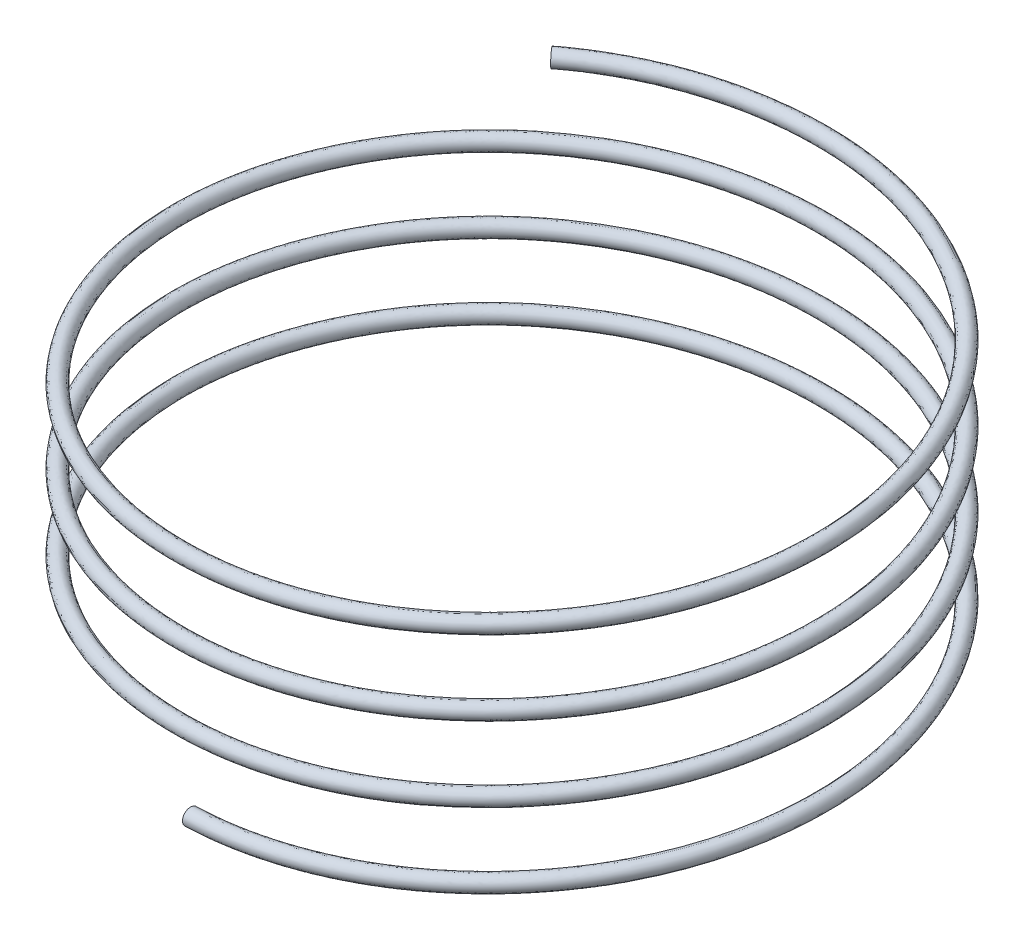
ISO-10303-21;
HEADER;
FILE_DESCRIPTION(('STEP AP214'),'2;1');
FILE_NAME('part.step','',(''),(''),'','','');
FILE_SCHEMA(('AUTOMOTIVE_DESIGN { 1 0 10303 214 1 1 1 1 }'));
ENDSEC;
DATA;
#1=APPLICATION_CONTEXT('core data for automotive mechanical design processes');
#2=APPLICATION_PROTOCOL_DEFINITION('international standard','automotive_design',2000,#1);
#3=PRODUCT_CONTEXT('',#1,'mechanical');
#4=PRODUCT('Part','Part','',(#3));
#5=PRODUCT_RELATED_PRODUCT_CATEGORY('part','',(#4));
#6=PRODUCT_DEFINITION_FORMATION('','',#4);
#7=PRODUCT_DEFINITION_CONTEXT('part definition',#1,'design');
#8=PRODUCT_DEFINITION('design','',#6,#7);
#9=PRODUCT_DEFINITION_SHAPE('','',#8);
#10=(LENGTH_UNIT() NAMED_UNIT(*) SI_UNIT(.MILLI.,.METRE.));
#11=(NAMED_UNIT(*) PLANE_ANGLE_UNIT() SI_UNIT($,.RADIAN.));
#12=(NAMED_UNIT(*) SI_UNIT($,.STERADIAN.) SOLID_ANGLE_UNIT());
#13=UNCERTAINTY_MEASURE_WITH_UNIT(LENGTH_MEASURE(1.E-05),#10,'distance_accuracy_value','');
#14=(GEOMETRIC_REPRESENTATION_CONTEXT(3) GLOBAL_UNCERTAINTY_ASSIGNED_CONTEXT((#13)) GLOBAL_UNIT_ASSIGNED_CONTEXT((#10,
#11,#12)) REPRESENTATION_CONTEXT('',''));
#15=CARTESIAN_POINT('',(0.,0.,0.));
#16=DIRECTION('',(0.,0.,1.));
#17=DIRECTION('',(1.,0.,0.));
#18=AXIS2_PLACEMENT_3D('',#15,#16,#17);
#19=CARTESIAN_POINT('',(0.,0.,10.));
#20=DIRECTION('',(1.,0.,0.));
#21=DIRECTION('',(0.,0.,-1.));
#22=AXIS2_PLACEMENT_3D('',#19,#20,#21);
#23=PLANE('',#22);
#24=CARTESIAN_POINT('',(0.,0.,10.));
#25=DIRECTION('',(1.,0.,0.));
#26=DIRECTION('',(0.,0.,-1.));
#27=AXIS2_PLACEMENT_3D('',#24,#25,#26);
#28=CIRCLE('',#27,0.25);
#29=CARTESIAN_POINT('',(0.,0.,9.75));
#30=VERTEX_POINT('',#29);
#31=EDGE_CURVE('E41',#30,#30,#28,.T.);
#32=ORIENTED_EDGE('',*,*,#31,.F.);
#33=EDGE_LOOP('',(#32));
#34=FACE_BOUND('',#33,.T.);
#35=ADVANCED_FACE('F33',(#34),#23,.F.);
#36=CARTESIAN_POINT('',(-6.42787609686579,8.4,-7.66044443118945));
#37=DIRECTION('',(-0.766044443118945,0.,0.642787609686579));
#38=DIRECTION('',(0.642787609686579,0.,0.766044443118945));
#39=AXIS2_PLACEMENT_3D('',#36,#37,#38);
#40=PLANE('',#39);
#41=CARTESIAN_POINT('',(-6.42787609686579,8.4,-7.66044443118945));
#42=DIRECTION('',(-0.766044443118945,0.,0.642787609686579));
#43=DIRECTION('',(0.642787609686579,0.,0.766044443118945));
#44=AXIS2_PLACEMENT_3D('',#41,#42,#43);
#45=CIRCLE('',#44,0.25);
#46=CARTESIAN_POINT('',(-6.2671433535875,8.40270245496322,-7.46897292753842));
#47=VERTEX_POINT('',#46);
#48=EDGE_CURVE('E11',#47,#47,#45,.T.);
#49=ORIENTED_EDGE('',*,*,#48,.T.);
#50=EDGE_LOOP('',(#49));
#51=FACE_BOUND('',#50,.T.);
#52=ADVANCED_FACE('F49',(#51),#40,.T.);
#53=CARTESIAN_POINT('',(0.,0.,9.75));
#54=CARTESIAN_POINT('',(5.62916512459885,0.193846153846153,9.75));
#55=CARTESIAN_POINT('',(8.44374768689828,0.387692307692307,4.875));
#56=CARTESIAN_POINT('',(11.2583302491977,0.58153846153846,0.));
#57=CARTESIAN_POINT('',(8.44374768689828,0.775384615384614,-4.875));
#58=CARTESIAN_POINT('',(5.62916512459886,0.969230769230767,-9.75));
#59=CARTESIAN_POINT('',(0.,1.16307692307692,-9.75));
#60=CARTESIAN_POINT('',(-5.62916512459885,1.35692307692307,-9.75));
#61=CARTESIAN_POINT('',(-8.44374768689828,1.55076923076923,-4.87500000000001));
#62=CARTESIAN_POINT('',(-11.2583302491977,1.74461538461538,0.));
#63=CARTESIAN_POINT('',(-8.44374768689828,1.93846153846153,4.87499999999999));
#64=CARTESIAN_POINT('',(-5.62916512459886,2.13230769230769,9.75));
#65=CARTESIAN_POINT('',(0.,2.32615384615384,9.75));
#66=CARTESIAN_POINT('',(5.62916512459885,2.51999999999999,9.75));
#67=CARTESIAN_POINT('',(8.44374768689828,2.71384615384615,4.875));
#68=CARTESIAN_POINT('',(11.2583302491977,2.9076923076923,0.));
#69=CARTESIAN_POINT('',(8.44374768689828,3.10153846153845,-4.875));
#70=CARTESIAN_POINT('',(5.62916512459886,3.29538461538461,-9.75));
#71=CARTESIAN_POINT('',(0.,3.48923076923076,-9.75));
#72=CARTESIAN_POINT('',(-5.62916512459885,3.68307692307691,-9.75));
#73=CARTESIAN_POINT('',(-8.44374768689828,3.87692307692307,-4.87500000000001));
#74=CARTESIAN_POINT('',(-11.2583302491977,4.07076923076922,0.));
#75=CARTESIAN_POINT('',(-8.44374768689828,4.26461538461538,4.87499999999999));
#76=CARTESIAN_POINT('',(-5.62916512459886,4.45846153846153,9.75));
#77=CARTESIAN_POINT('',(0.,4.65230769230768,9.75));
#78=CARTESIAN_POINT('',(5.62916512459885,4.84615384615384,9.75));
#79=CARTESIAN_POINT('',(8.44374768689828,5.03999999999999,4.875));
#80=CARTESIAN_POINT('',(11.2583302491977,5.23384615384614,0.));
#81=CARTESIAN_POINT('',(8.44374768689828,5.4276923076923,-4.875));
#82=CARTESIAN_POINT('',(5.62916512459886,5.62153846153845,-9.75));
#83=CARTESIAN_POINT('',(0.,5.8153846153846,-9.75));
#84=CARTESIAN_POINT('',(-5.62916512459885,6.00923076923076,-9.75));
#85=CARTESIAN_POINT('',(-8.44374768689828,6.20307692307691,-4.87500000000001));
#86=CARTESIAN_POINT('',(-11.2583302491977,6.39692307692306,0.));
#87=CARTESIAN_POINT('',(-8.44374768689828,6.59076923076922,4.87499999999999));
#88=CARTESIAN_POINT('',(-5.62916512459886,6.78461538461537,9.75));
#89=CARTESIAN_POINT('',(0.,6.97846153846152,9.75));
#90=CARTESIAN_POINT('',(5.62916512459885,7.17230769230768,9.75));
#91=CARTESIAN_POINT('',(8.44374768689828,7.36615384615383,4.875));
#92=CARTESIAN_POINT('',(11.2583302491977,7.55999999999998,0.));
#93=CARTESIAN_POINT('',(8.44374768689828,7.75384615384614,-4.875));
#94=CARTESIAN_POINT('',(5.62916512459886,7.94769230769229,-9.75));
#95=CARTESIAN_POINT('',(0.,8.14153846153844,-9.75));
#96=CARTESIAN_POINT('',(-5.62916512459885,8.3353846153846,-9.75));
#97=CARTESIAN_POINT('',(-8.44374768689828,8.52923076923075,-4.87500000000001));
#98=CARTESIAN_POINT('',(-11.2583302491977,8.7230769230769,0.));
#99=CARTESIAN_POINT('',(-8.44374768689828,8.91692307692306,4.87499999999999));
#100=CARTESIAN_POINT('',(-5.62916512459886,9.11076923076921,9.75));
#101=CARTESIAN_POINT('',(0.,9.30461538461536,9.75));
#102=CARTESIAN_POINT('',(0.,0.499999999999999,9.75));
#103=CARTESIAN_POINT('',(5.62916512459885,0.693846153846152,9.75));
#104=CARTESIAN_POINT('',(8.44374768689828,0.887692307692306,4.875));
#105=CARTESIAN_POINT('',(11.2583302491977,1.08153846153846,0.));
#106=CARTESIAN_POINT('',(8.44374768689828,1.27538461538461,-4.875));
#107=CARTESIAN_POINT('',(5.62916512459886,1.46923076923077,-9.75));
#108=CARTESIAN_POINT('',(0.,1.66307692307692,-9.75));
#109=CARTESIAN_POINT('',(-5.62916512459885,1.85692307692307,-9.75));
#110=CARTESIAN_POINT('',(-8.44374768689828,2.05076923076923,-4.87500000000001));
#111=CARTESIAN_POINT('',(-11.2583302491977,2.24461538461538,0.));
#112=CARTESIAN_POINT('',(-8.44374768689828,2.43846153846153,4.87499999999999));
#113=CARTESIAN_POINT('',(-5.62916512459886,2.63230769230769,9.75));
#114=CARTESIAN_POINT('',(0.,2.82615384615384,9.75));
#115=CARTESIAN_POINT('',(5.62916512459885,3.01999999999999,9.75));
#116=CARTESIAN_POINT('',(8.44374768689828,3.21384615384615,4.875));
#117=CARTESIAN_POINT('',(11.2583302491977,3.4076923076923,0.));
#118=CARTESIAN_POINT('',(8.44374768689828,3.60153846153845,-4.875));
#119=CARTESIAN_POINT('',(5.62916512459886,3.79538461538461,-9.75));
#120=CARTESIAN_POINT('',(0.,3.98923076923076,-9.75));
#121=CARTESIAN_POINT('',(-5.62916512459885,4.18307692307691,-9.75));
#122=CARTESIAN_POINT('',(-8.44374768689828,4.37692307692307,-4.87500000000001));
#123=CARTESIAN_POINT('',(-11.2583302491977,4.57076923076922,0.));
#124=CARTESIAN_POINT('',(-8.44374768689828,4.76461538461537,4.87499999999999));
#125=CARTESIAN_POINT('',(-5.62916512459886,4.95846153846153,9.75));
#126=CARTESIAN_POINT('',(0.,5.15230769230768,9.75));
#127=CARTESIAN_POINT('',(5.62916512459885,5.34615384615383,9.75));
#128=CARTESIAN_POINT('',(8.44374768689828,5.53999999999999,4.875));
#129=CARTESIAN_POINT('',(11.2583302491977,5.73384615384614,0.));
#130=CARTESIAN_POINT('',(8.44374768689828,5.92769230769229,-4.875));
#131=CARTESIAN_POINT('',(5.62916512459886,6.12153846153845,-9.75));
#132=CARTESIAN_POINT('',(0.,6.3153846153846,-9.75));
#133=CARTESIAN_POINT('',(-5.62916512459885,6.50923076923076,-9.75));
#134=CARTESIAN_POINT('',(-8.44374768689828,6.70307692307691,-4.87500000000001));
#135=CARTESIAN_POINT('',(-11.2583302491977,6.89692307692306,0.));
#136=CARTESIAN_POINT('',(-8.44374768689828,7.09076923076922,4.87499999999999));
#137=CARTESIAN_POINT('',(-5.62916512459886,7.28461538461537,9.75));
#138=CARTESIAN_POINT('',(0.,7.47846153846152,9.75));
#139=CARTESIAN_POINT('',(5.62916512459885,7.67230769230768,9.75));
#140=CARTESIAN_POINT('',(8.44374768689828,7.86615384615383,4.875));
#141=CARTESIAN_POINT('',(11.2583302491977,8.05999999999998,0.));
#142=CARTESIAN_POINT('',(8.44374768689828,8.25384615384614,-4.875));
#143=CARTESIAN_POINT('',(5.62916512459886,8.44769230769229,-9.75));
#144=CARTESIAN_POINT('',(0.,8.64153846153844,-9.75));
#145=CARTESIAN_POINT('',(-5.62916512459885,8.8353846153846,-9.75));
#146=CARTESIAN_POINT('',(-8.44374768689828,9.02923076923075,-4.87500000000001));
#147=CARTESIAN_POINT('',(-11.2583302491977,9.2230769230769,0.));
#148=CARTESIAN_POINT('',(-8.44374768689828,9.41692307692306,4.87499999999999));
#149=CARTESIAN_POINT('',(-5.62916512459886,9.61076923076921,9.75));
#150=CARTESIAN_POINT('',(0.,9.80461538461536,9.75));
#151=CARTESIAN_POINT('',(0.,0.499999999999999,10.25));
#152=CARTESIAN_POINT('',(5.91784025919366,0.693846153846152,10.25));
#153=CARTESIAN_POINT('',(8.8767603887905,0.887692307692306,5.125));
#154=CARTESIAN_POINT('',(11.8356805183873,1.08153846153846,0.));
#155=CARTESIAN_POINT('',(8.8767603887905,1.27538461538461,-5.125));
#156=CARTESIAN_POINT('',(5.91784025919367,1.46923076923077,-10.25));
#157=CARTESIAN_POINT('',(0.,1.66307692307692,-10.25));
#158=CARTESIAN_POINT('',(-5.91784025919366,1.85692307692307,-10.25));
#159=CARTESIAN_POINT('',(-8.8767603887905,2.05076923076923,-5.12500000000001));
#160=CARTESIAN_POINT('',(-11.8356805183873,2.24461538461538,0.));
#161=CARTESIAN_POINT('',(-8.8767603887905,2.43846153846153,5.12499999999999));
#162=CARTESIAN_POINT('',(-5.91784025919367,2.63230769230769,10.25));
#163=CARTESIAN_POINT('',(0.,2.82615384615384,10.25));
#164=CARTESIAN_POINT('',(5.91784025919366,3.01999999999999,10.25));
#165=CARTESIAN_POINT('',(8.8767603887905,3.21384615384615,5.125));
#166=CARTESIAN_POINT('',(11.8356805183873,3.4076923076923,0.));
#167=CARTESIAN_POINT('',(8.8767603887905,3.60153846153845,-5.125));
#168=CARTESIAN_POINT('',(5.91784025919367,3.79538461538461,-10.25));
#169=CARTESIAN_POINT('',(0.,3.98923076923076,-10.25));
#170=CARTESIAN_POINT('',(-5.91784025919366,4.18307692307691,-10.25));
#171=CARTESIAN_POINT('',(-8.8767603887905,4.37692307692307,-5.12500000000001));
#172=CARTESIAN_POINT('',(-11.8356805183873,4.57076923076922,0.));
#173=CARTESIAN_POINT('',(-8.8767603887905,4.76461538461537,5.12499999999999));
#174=CARTESIAN_POINT('',(-5.91784025919367,4.95846153846153,10.25));
#175=CARTESIAN_POINT('',(0.,5.15230769230768,10.25));
#176=CARTESIAN_POINT('',(5.91784025919366,5.34615384615383,10.25));
#177=CARTESIAN_POINT('',(8.8767603887905,5.53999999999999,5.125));
#178=CARTESIAN_POINT('',(11.8356805183873,5.73384615384614,0.));
#179=CARTESIAN_POINT('',(8.8767603887905,5.92769230769229,-5.125));
#180=CARTESIAN_POINT('',(5.91784025919367,6.12153846153845,-10.25));
#181=CARTESIAN_POINT('',(0.,6.3153846153846,-10.25));
#182=CARTESIAN_POINT('',(-5.91784025919366,6.50923076923076,-10.25));
#183=CARTESIAN_POINT('',(-8.8767603887905,6.70307692307691,-5.12500000000001));
#184=CARTESIAN_POINT('',(-11.8356805183873,6.89692307692306,0.));
#185=CARTESIAN_POINT('',(-8.8767603887905,7.09076923076922,5.12499999999999));
#186=CARTESIAN_POINT('',(-5.91784025919367,7.28461538461537,10.25));
#187=CARTESIAN_POINT('',(0.,7.47846153846152,10.25));
#188=CARTESIAN_POINT('',(5.91784025919366,7.67230769230768,10.25));
#189=CARTESIAN_POINT('',(8.8767603887905,7.86615384615383,5.125));
#190=CARTESIAN_POINT('',(11.8356805183873,8.05999999999998,0.));
#191=CARTESIAN_POINT('',(8.8767603887905,8.25384615384614,-5.125));
#192=CARTESIAN_POINT('',(5.91784025919367,8.44769230769229,-10.25));
#193=CARTESIAN_POINT('',(0.,8.64153846153844,-10.25));
#194=CARTESIAN_POINT('',(-5.91784025919366,8.8353846153846,-10.25));
#195=CARTESIAN_POINT('',(-8.8767603887905,9.02923076923075,-5.12500000000001));
#196=CARTESIAN_POINT('',(-11.8356805183873,9.2230769230769,0.));
#197=CARTESIAN_POINT('',(-8.8767603887905,9.41692307692306,5.12499999999999));
#198=CARTESIAN_POINT('',(-5.91784025919367,9.61076923076921,10.25));
#199=CARTESIAN_POINT('',(0.,9.80461538461536,10.25));
#200=CARTESIAN_POINT('',(0.,0.,10.25));
#201=CARTESIAN_POINT('',(5.91784025919366,0.193846153846153,10.25));
#202=CARTESIAN_POINT('',(8.8767603887905,0.387692307692307,5.125));
#203=CARTESIAN_POINT('',(11.8356805183873,0.58153846153846,0.));
#204=CARTESIAN_POINT('',(8.8767603887905,0.775384615384614,-5.125));
#205=CARTESIAN_POINT('',(5.91784025919367,0.969230769230767,-10.25));
#206=CARTESIAN_POINT('',(0.,1.16307692307692,-10.25));
#207=CARTESIAN_POINT('',(-5.91784025919366,1.35692307692307,-10.25));
#208=CARTESIAN_POINT('',(-8.8767603887905,1.55076923076923,-5.12500000000001));
#209=CARTESIAN_POINT('',(-11.8356805183873,1.74461538461538,0.));
#210=CARTESIAN_POINT('',(-8.8767603887905,1.93846153846153,5.12499999999999));
#211=CARTESIAN_POINT('',(-5.91784025919367,2.13230769230769,10.25));
#212=CARTESIAN_POINT('',(0.,2.32615384615384,10.25));
#213=CARTESIAN_POINT('',(5.91784025919366,2.51999999999999,10.25));
#214=CARTESIAN_POINT('',(8.8767603887905,2.71384615384615,5.125));
#215=CARTESIAN_POINT('',(11.8356805183873,2.9076923076923,0.));
#216=CARTESIAN_POINT('',(8.8767603887905,3.10153846153845,-5.125));
#217=CARTESIAN_POINT('',(5.91784025919367,3.29538461538461,-10.25));
#218=CARTESIAN_POINT('',(0.,3.48923076923076,-10.25));
#219=CARTESIAN_POINT('',(-5.91784025919366,3.68307692307691,-10.25));
#220=CARTESIAN_POINT('',(-8.8767603887905,3.87692307692307,-5.12500000000001));
#221=CARTESIAN_POINT('',(-11.8356805183873,4.07076923076922,0.));
#222=CARTESIAN_POINT('',(-8.8767603887905,4.26461538461538,5.12499999999999));
#223=CARTESIAN_POINT('',(-5.91784025919367,4.45846153846153,10.25));
#224=CARTESIAN_POINT('',(0.,4.65230769230768,10.25));
#225=CARTESIAN_POINT('',(5.91784025919366,4.84615384615384,10.25));
#226=CARTESIAN_POINT('',(8.8767603887905,5.03999999999999,5.125));
#227=CARTESIAN_POINT('',(11.8356805183873,5.23384615384614,0.));
#228=CARTESIAN_POINT('',(8.8767603887905,5.4276923076923,-5.125));
#229=CARTESIAN_POINT('',(5.91784025919367,5.62153846153845,-10.25));
#230=CARTESIAN_POINT('',(0.,5.8153846153846,-10.25));
#231=CARTESIAN_POINT('',(-5.91784025919366,6.00923076923076,-10.25));
#232=CARTESIAN_POINT('',(-8.8767603887905,6.20307692307691,-5.12500000000001));
#233=CARTESIAN_POINT('',(-11.8356805183873,6.39692307692306,0.));
#234=CARTESIAN_POINT('',(-8.8767603887905,6.59076923076922,5.12499999999999));
#235=CARTESIAN_POINT('',(-5.91784025919367,6.78461538461537,10.25));
#236=CARTESIAN_POINT('',(0.,6.97846153846152,10.25));
#237=CARTESIAN_POINT('',(5.91784025919366,7.17230769230768,10.25));
#238=CARTESIAN_POINT('',(8.8767603887905,7.36615384615383,5.125));
#239=CARTESIAN_POINT('',(11.8356805183873,7.55999999999998,0.));
#240=CARTESIAN_POINT('',(8.8767603887905,7.75384615384614,-5.125));
#241=CARTESIAN_POINT('',(5.91784025919367,7.94769230769229,-10.25));
#242=CARTESIAN_POINT('',(0.,8.14153846153844,-10.25));
#243=CARTESIAN_POINT('',(-5.91784025919366,8.3353846153846,-10.25));
#244=CARTESIAN_POINT('',(-8.8767603887905,8.52923076923075,-5.12500000000001));
#245=CARTESIAN_POINT('',(-11.8356805183873,8.7230769230769,0.));
#246=CARTESIAN_POINT('',(-8.8767603887905,8.91692307692306,5.12499999999999));
#247=CARTESIAN_POINT('',(-5.91784025919367,9.11076923076921,10.25));
#248=CARTESIAN_POINT('',(0.,9.30461538461536,10.25));
#249=CARTESIAN_POINT('',(0.,-0.499999999999999,10.25));
#250=CARTESIAN_POINT('',(5.91784025919366,-0.306153846153846,10.25));
#251=CARTESIAN_POINT('',(8.8767603887905,-0.112307692307692,5.125));
#252=CARTESIAN_POINT('',(11.8356805183873,0.0815384615384614,0.));
#253=CARTESIAN_POINT('',(8.8767603887905,0.275384615384615,-5.125));
#254=CARTESIAN_POINT('',(5.91784025919367,0.469230769230768,-10.25));
#255=CARTESIAN_POINT('',(0.,0.663076923076922,-10.25));
#256=CARTESIAN_POINT('',(-5.91784025919366,0.856923076923075,-10.25));
#257=CARTESIAN_POINT('',(-8.8767603887905,1.05076923076923,-5.12500000000001));
#258=CARTESIAN_POINT('',(-11.8356805183873,1.24461538461538,0.));
#259=CARTESIAN_POINT('',(-8.8767603887905,1.43846153846154,5.12499999999999));
#260=CARTESIAN_POINT('',(-5.91784025919367,1.63230769230769,10.25));
#261=CARTESIAN_POINT('',(0.,1.82615384615384,10.25));
#262=CARTESIAN_POINT('',(5.91784025919366,2.02,10.25));
#263=CARTESIAN_POINT('',(8.8767603887905,2.21384615384615,5.125));
#264=CARTESIAN_POINT('',(11.8356805183873,2.4076923076923,0.));
#265=CARTESIAN_POINT('',(8.8767603887905,2.60153846153846,-5.125));
#266=CARTESIAN_POINT('',(5.91784025919367,2.79538461538461,-10.25));
#267=CARTESIAN_POINT('',(0.,2.98923076923076,-10.25));
#268=CARTESIAN_POINT('',(-5.91784025919366,3.18307692307692,-10.25));
#269=CARTESIAN_POINT('',(-8.8767603887905,3.37692307692307,-5.12500000000001));
#270=CARTESIAN_POINT('',(-11.8356805183873,3.57076923076922,0.));
#271=CARTESIAN_POINT('',(-8.8767603887905,3.76461538461538,5.12499999999999));
#272=CARTESIAN_POINT('',(-5.91784025919367,3.95846153846153,10.25));
#273=CARTESIAN_POINT('',(0.,4.15230769230768,10.25));
#274=CARTESIAN_POINT('',(5.91784025919366,4.34615384615384,10.25));
#275=CARTESIAN_POINT('',(8.8767603887905,4.53999999999999,5.125));
#276=CARTESIAN_POINT('',(11.8356805183873,4.73384615384614,0.));
#277=CARTESIAN_POINT('',(8.8767603887905,4.9276923076923,-5.125));
#278=CARTESIAN_POINT('',(5.91784025919367,5.12153846153845,-10.25));
#279=CARTESIAN_POINT('',(0.,5.3153846153846,-10.25));
#280=CARTESIAN_POINT('',(-5.91784025919366,5.50923076923076,-10.25));
#281=CARTESIAN_POINT('',(-8.8767603887905,5.70307692307691,-5.12500000000001));
#282=CARTESIAN_POINT('',(-11.8356805183873,5.89692307692306,0.));
#283=CARTESIAN_POINT('',(-8.8767603887905,6.09076923076922,5.12499999999999));
#284=CARTESIAN_POINT('',(-5.91784025919367,6.28461538461537,10.25));
#285=CARTESIAN_POINT('',(0.,6.47846153846152,10.25));
#286=CARTESIAN_POINT('',(5.91784025919366,6.67230769230768,10.25));
#287=CARTESIAN_POINT('',(8.8767603887905,6.86615384615383,5.125));
#288=CARTESIAN_POINT('',(11.8356805183873,7.05999999999998,0.));
#289=CARTESIAN_POINT('',(8.8767603887905,7.25384615384614,-5.125));
#290=CARTESIAN_POINT('',(5.91784025919367,7.44769230769229,-10.25));
#291=CARTESIAN_POINT('',(0.,7.64153846153844,-10.25));
#292=CARTESIAN_POINT('',(-5.91784025919366,7.8353846153846,-10.25));
#293=CARTESIAN_POINT('',(-8.8767603887905,8.02923076923075,-5.12500000000001));
#294=CARTESIAN_POINT('',(-11.8356805183873,8.2230769230769,0.));
#295=CARTESIAN_POINT('',(-8.8767603887905,8.41692307692306,5.12499999999999));
#296=CARTESIAN_POINT('',(-5.91784025919367,8.61076923076921,10.25));
#297=CARTESIAN_POINT('',(0.,8.80461538461537,10.25));
#298=CARTESIAN_POINT('',(0.,-0.499999999999999,9.75));
#299=CARTESIAN_POINT('',(5.62916512459885,-0.306153846153846,9.75));
#300=CARTESIAN_POINT('',(8.44374768689828,-0.112307692307692,4.875));
#301=CARTESIAN_POINT('',(11.2583302491977,0.0815384615384614,0.));
#302=CARTESIAN_POINT('',(8.44374768689828,0.275384615384615,-4.875));
#303=CARTESIAN_POINT('',(5.62916512459886,0.469230769230768,-9.75));
#304=CARTESIAN_POINT('',(0.,0.663076923076922,-9.75));
#305=CARTESIAN_POINT('',(-5.62916512459885,0.856923076923075,-9.75));
#306=CARTESIAN_POINT('',(-8.44374768689828,1.05076923076923,-4.87500000000001));
#307=CARTESIAN_POINT('',(-11.2583302491977,1.24461538461538,0.));
#308=CARTESIAN_POINT('',(-8.44374768689828,1.43846153846154,4.87499999999999));
#309=CARTESIAN_POINT('',(-5.62916512459886,1.63230769230769,9.75));
#310=CARTESIAN_POINT('',(0.,1.82615384615384,9.75));
#311=CARTESIAN_POINT('',(5.62916512459885,2.02,9.75));
#312=CARTESIAN_POINT('',(8.44374768689828,2.21384615384615,4.875));
#313=CARTESIAN_POINT('',(11.2583302491977,2.4076923076923,0.));
#314=CARTESIAN_POINT('',(8.44374768689828,2.60153846153846,-4.875));
#315=CARTESIAN_POINT('',(5.62916512459886,2.79538461538461,-9.75));
#316=CARTESIAN_POINT('',(0.,2.98923076923076,-9.75));
#317=CARTESIAN_POINT('',(-5.62916512459885,3.18307692307692,-9.75));
#318=CARTESIAN_POINT('',(-8.44374768689828,3.37692307692307,-4.87500000000001));
#319=CARTESIAN_POINT('',(-11.2583302491977,3.57076923076922,0.));
#320=CARTESIAN_POINT('',(-8.44374768689828,3.76461538461538,4.87499999999999));
#321=CARTESIAN_POINT('',(-5.62916512459886,3.95846153846153,9.75));
#322=CARTESIAN_POINT('',(0.,4.15230769230768,9.75));
#323=CARTESIAN_POINT('',(5.62916512459885,4.34615384615384,9.75));
#324=CARTESIAN_POINT('',(8.44374768689828,4.53999999999999,4.875));
#325=CARTESIAN_POINT('',(11.2583302491977,4.73384615384614,0.));
#326=CARTESIAN_POINT('',(8.44374768689828,4.9276923076923,-4.875));
#327=CARTESIAN_POINT('',(5.62916512459886,5.12153846153845,-9.75));
#328=CARTESIAN_POINT('',(0.,5.3153846153846,-9.75));
#329=CARTESIAN_POINT('',(-5.62916512459885,5.50923076923076,-9.75));
#330=CARTESIAN_POINT('',(-8.44374768689828,5.70307692307691,-4.87500000000001));
#331=CARTESIAN_POINT('',(-11.2583302491977,5.89692307692306,0.));
#332=CARTESIAN_POINT('',(-8.44374768689828,6.09076923076922,4.87499999999999));
#333=CARTESIAN_POINT('',(-5.62916512459886,6.28461538461537,9.75));
#334=CARTESIAN_POINT('',(0.,6.47846153846152,9.75));
#335=CARTESIAN_POINT('',(5.62916512459885,6.67230769230768,9.75));
#336=CARTESIAN_POINT('',(8.44374768689828,6.86615384615383,4.875));
#337=CARTESIAN_POINT('',(11.2583302491977,7.05999999999998,0.));
#338=CARTESIAN_POINT('',(8.44374768689828,7.25384615384614,-4.875));
#339=CARTESIAN_POINT('',(5.62916512459886,7.44769230769229,-9.75));
#340=CARTESIAN_POINT('',(0.,7.64153846153844,-9.75));
#341=CARTESIAN_POINT('',(-5.62916512459885,7.8353846153846,-9.75));
#342=CARTESIAN_POINT('',(-8.44374768689828,8.02923076923075,-4.87500000000001));
#343=CARTESIAN_POINT('',(-11.2583302491977,8.2230769230769,0.));
#344=CARTESIAN_POINT('',(-8.44374768689828,8.41692307692306,4.87499999999999));
#345=CARTESIAN_POINT('',(-5.62916512459886,8.61076923076921,9.75));
#346=CARTESIAN_POINT('',(0.,8.80461538461537,9.75));
#347=CARTESIAN_POINT('',(0.,0.,9.75));
#348=CARTESIAN_POINT('',(5.62916512459885,0.193846153846153,9.75));
#349=CARTESIAN_POINT('',(8.44374768689828,0.387692307692307,4.875));
#350=CARTESIAN_POINT('',(11.2583302491977,0.58153846153846,0.));
#351=CARTESIAN_POINT('',(8.44374768689828,0.775384615384614,-4.875));
#352=CARTESIAN_POINT('',(5.62916512459886,0.969230769230767,-9.75));
#353=CARTESIAN_POINT('',(0.,1.16307692307692,-9.75));
#354=CARTESIAN_POINT('',(-5.62916512459885,1.35692307692307,-9.75));
#355=CARTESIAN_POINT('',(-8.44374768689828,1.55076923076923,-4.87500000000001));
#356=CARTESIAN_POINT('',(-11.2583302491977,1.74461538461538,0.));
#357=CARTESIAN_POINT('',(-8.44374768689828,1.93846153846153,4.87499999999999));
#358=CARTESIAN_POINT('',(-5.62916512459886,2.13230769230769,9.75));
#359=CARTESIAN_POINT('',(0.,2.32615384615384,9.75));
#360=CARTESIAN_POINT('',(5.62916512459885,2.51999999999999,9.75));
#361=CARTESIAN_POINT('',(8.44374768689828,2.71384615384615,4.875));
#362=CARTESIAN_POINT('',(11.2583302491977,2.9076923076923,0.));
#363=CARTESIAN_POINT('',(8.44374768689828,3.10153846153845,-4.875));
#364=CARTESIAN_POINT('',(5.62916512459886,3.29538461538461,-9.75));
#365=CARTESIAN_POINT('',(0.,3.48923076923076,-9.75));
#366=CARTESIAN_POINT('',(-5.62916512459885,3.68307692307691,-9.75));
#367=CARTESIAN_POINT('',(-8.44374768689828,3.87692307692307,-4.87500000000001));
#368=CARTESIAN_POINT('',(-11.2583302491977,4.07076923076922,0.));
#369=CARTESIAN_POINT('',(-8.44374768689828,4.26461538461538,4.87499999999999));
#370=CARTESIAN_POINT('',(-5.62916512459886,4.45846153846153,9.75));
#371=CARTESIAN_POINT('',(0.,4.65230769230768,9.75));
#372=CARTESIAN_POINT('',(5.62916512459885,4.84615384615384,9.75));
#373=CARTESIAN_POINT('',(8.44374768689828,5.03999999999999,4.875));
#374=CARTESIAN_POINT('',(11.2583302491977,5.23384615384614,0.));
#375=CARTESIAN_POINT('',(8.44374768689828,5.4276923076923,-4.875));
#376=CARTESIAN_POINT('',(5.62916512459886,5.62153846153845,-9.75));
#377=CARTESIAN_POINT('',(0.,5.8153846153846,-9.75));
#378=CARTESIAN_POINT('',(-5.62916512459885,6.00923076923076,-9.75));
#379=CARTESIAN_POINT('',(-8.44374768689828,6.20307692307691,-4.87500000000001));
#380=CARTESIAN_POINT('',(-11.2583302491977,6.39692307692306,0.));
#381=CARTESIAN_POINT('',(-8.44374768689828,6.59076923076922,4.87499999999999));
#382=CARTESIAN_POINT('',(-5.62916512459886,6.78461538461537,9.75));
#383=CARTESIAN_POINT('',(0.,6.97846153846152,9.75));
#384=CARTESIAN_POINT('',(5.62916512459885,7.17230769230768,9.75));
#385=CARTESIAN_POINT('',(8.44374768689828,7.36615384615383,4.875));
#386=CARTESIAN_POINT('',(11.2583302491977,7.55999999999998,0.));
#387=CARTESIAN_POINT('',(8.44374768689828,7.75384615384614,-4.875));
#388=CARTESIAN_POINT('',(5.62916512459886,7.94769230769229,-9.75));
#389=CARTESIAN_POINT('',(0.,8.14153846153844,-9.75));
#390=CARTESIAN_POINT('',(-5.62916512459885,8.3353846153846,-9.75));
#391=CARTESIAN_POINT('',(-8.44374768689828,8.52923076923075,-4.87500000000001));
#392=CARTESIAN_POINT('',(-11.2583302491977,8.7230769230769,0.));
#393=CARTESIAN_POINT('',(-8.44374768689828,8.91692307692306,4.87499999999999));
#394=CARTESIAN_POINT('',(-5.62916512459886,9.11076923076921,9.75));
#395=CARTESIAN_POINT('',(0.,9.30461538461536,9.75));
#396=(BOUNDED_SURFACE() B_SPLINE_SURFACE(3,2,((#53,#54,#55,#56,#57,#58,#59,#60,#61,#62,#63,#64,
#65,#66,#67,#68,#69,#70,#71,#72,#73,#74,#75,#76,#77,#78,#79,#80,#81,#82,#83,#84,#85,#86,#87,#88,
#89,#90,#91,#92,#93,#94,#95,#96,#97,#98,#99,#100,#101),(#102,#103,#104,#105,#106,#107,#108,#109,
#110,#111,#112,#113,#114,#115,#116,#117,#118,#119,#120,#121,#122,#123,#124,#125,#126,#127,#128,
#129,#130,#131,#132,#133,#134,#135,#136,#137,#138,#139,#140,#141,#142,#143,#144,#145,#146,#147,
#148,#149,#150),(#151,#152,#153,#154,#155,#156,#157,#158,#159,#160,#161,#162,#163,#164,#165,
#166,#167,#168,#169,#170,#171,#172,#173,#174,#175,#176,#177,#178,#179,#180,#181,#182,#183,#184,
#185,#186,#187,#188,#189,#190,#191,#192,#193,#194,#195,#196,#197,#198,#199),(#200,#201,#202,
#203,#204,#205,#206,#207,#208,#209,#210,#211,#212,#213,#214,#215,#216,#217,#218,#219,#220,#221,
#222,#223,#224,#225,#226,#227,#228,#229,#230,#231,#232,#233,#234,#235,#236,#237,#238,#239,#240,
#241,#242,#243,#244,#245,#246,#247,#248),(#249,#250,#251,#252,#253,#254,#255,#256,#257,#258,
#259,#260,#261,#262,#263,#264,#265,#266,#267,#268,#269,#270,#271,#272,#273,#274,#275,#276,#277,
#278,#279,#280,#281,#282,#283,#284,#285,#286,#287,#288,#289,#290,#291,#292,#293,#294,#295,#296,
#297),(#298,#299,#300,#301,#302,#303,#304,#305,#306,#307,#308,#309,#310,#311,#312,#313,#314,
#315,#316,#317,#318,#319,#320,#321,#322,#323,#324,#325,#326,#327,#328,#329,#330,#331,#332,#333,
#334,#335,#336,#337,#338,#339,#340,#341,#342,#343,#344,#345,#346),(#347,#348,#349,#350,#351,
#352,#353,#354,#355,#356,#357,#358,#359,#360,#361,#362,#363,#364,#365,#366,#367,#368,#369,#370,
#371,#372,#373,#374,#375,#376,#377,#378,#379,#380,#381,#382,#383,#384,#385,#386,#387,#388,#389,
#390,#391,#392,#393,#394,#395)),.UNSPECIFIED.,.T.,.F.,.F.) B_SPLINE_SURFACE_WITH_KNOTS((4,3,4),
(3,2,2,2,2,2,2,2,2,2,2,2,2,2,2,2,2,2,2,2,2,2,2,2,3),(0.,0.5,1.),(0.,0.0416666666666667,
0.0833333333333333,0.125,0.166666666666667,0.208333333333333,0.25,0.291666666666667,
0.333333333333333,0.375,0.416666666666667,0.458333333333333,0.5,0.541666666666667,
0.583333333333333,0.625,0.666666666666667,0.708333333333333,0.75,0.791666666666667,
0.833333333333333,0.875,0.916666666666667,0.958333333333333,1.),
.UNSPECIFIED.) GEOMETRIC_REPRESENTATION_ITEM() RATIONAL_B_SPLINE_SURFACE(((1.,0.866025403784439,
1.,0.866025403784439,1.,0.866025403784439,1.,0.866025403784439,1.,0.866025403784439,1.,
0.866025403784439,1.,0.866025403784439,1.,0.866025403784439,1.,0.866025403784439,1.,
0.866025403784439,1.,0.866025403784439,1.,0.866025403784439,1.,0.866025403784439,1.,
0.866025403784439,1.,0.866025403784439,1.,0.866025403784439,1.,0.866025403784439,1.,
0.866025403784439,1.,0.866025403784439,1.,0.866025403784439,1.,0.866025403784439,1.,
0.866025403784439,1.,0.866025403784439,1.,0.866025403784439,1.),(0.333333333333333,
0.288675134594813,0.333333333333333,0.288675134594813,0.333333333333333,0.288675134594813,
0.333333333333333,0.288675134594813,0.333333333333333,0.288675134594813,0.333333333333333,
0.288675134594813,0.333333333333333,0.288675134594813,0.333333333333333,0.288675134594813,
0.333333333333333,0.288675134594813,0.333333333333333,0.288675134594813,0.333333333333333,
0.288675134594813,0.333333333333333,0.288675134594813,0.333333333333333,0.288675134594813,
0.333333333333333,0.288675134594813,0.333333333333333,0.288675134594813,0.333333333333333,
0.288675134594813,0.333333333333333,0.288675134594813,0.333333333333333,0.288675134594813,
0.333333333333333,0.288675134594813,0.333333333333333,0.288675134594813,0.333333333333333,
0.288675134594813,0.333333333333333,0.288675134594813,0.333333333333333,0.288675134594813,
0.333333333333333,0.288675134594813,0.333333333333333),(0.333333333333333,0.288675134594813,
0.333333333333333,0.288675134594813,0.333333333333333,0.288675134594813,0.333333333333333,
0.288675134594813,0.333333333333333,0.288675134594813,0.333333333333333,0.288675134594813,
0.333333333333333,0.288675134594813,0.333333333333333,0.288675134594813,0.333333333333333,
0.288675134594813,0.333333333333333,0.288675134594813,0.333333333333333,0.288675134594813,
0.333333333333333,0.288675134594813,0.333333333333333,0.288675134594813,0.333333333333333,
0.288675134594813,0.333333333333333,0.288675134594813,0.333333333333333,0.288675134594813,
0.333333333333333,0.288675134594813,0.333333333333333,0.288675134594813,0.333333333333333,
0.288675134594813,0.333333333333333,0.288675134594813,0.333333333333333,0.288675134594813,
0.333333333333333,0.288675134594813,0.333333333333333,0.288675134594813,0.333333333333333,
0.288675134594813,0.333333333333333),(1.,0.866025403784439,1.,0.866025403784439,1.,
0.866025403784439,1.,0.866025403784439,1.,0.866025403784439,1.,0.866025403784439,1.,
0.866025403784439,1.,0.866025403784439,1.,0.866025403784439,1.,0.866025403784439,1.,
0.866025403784439,1.,0.866025403784439,1.,0.866025403784439,1.,0.866025403784439,1.,
0.866025403784439,1.,0.866025403784439,1.,0.866025403784439,1.,0.866025403784439,1.,
0.866025403784439,1.,0.866025403784439,1.,0.866025403784439,1.,0.866025403784439,1.,
0.866025403784439,1.,0.866025403784439,1.),(0.333333333333333,0.288675134594813,
0.333333333333333,0.288675134594813,0.333333333333333,0.288675134594813,0.333333333333333,
0.288675134594813,0.333333333333333,0.288675134594813,0.333333333333333,0.288675134594813,
0.333333333333333,0.288675134594813,0.333333333333333,0.288675134594813,0.333333333333333,
0.288675134594813,0.333333333333333,0.288675134594813,0.333333333333333,0.288675134594813,
0.333333333333333,0.288675134594813,0.333333333333333,0.288675134594813,0.333333333333333,
0.288675134594813,0.333333333333333,0.288675134594813,0.333333333333333,0.288675134594813,
0.333333333333333,0.288675134594813,0.333333333333333,0.288675134594813,0.333333333333333,
0.288675134594813,0.333333333333333,0.288675134594813,0.333333333333333,0.288675134594813,
0.333333333333333,0.288675134594813,0.333333333333333,0.288675134594813,0.333333333333333,
0.288675134594813,0.333333333333333),(0.333333333333333,0.288675134594813,0.333333333333333,
0.288675134594813,0.333333333333333,0.288675134594813,0.333333333333333,0.288675134594813,
0.333333333333333,0.288675134594813,0.333333333333333,0.288675134594813,0.333333333333333,
0.288675134594813,0.333333333333333,0.288675134594813,0.333333333333333,0.288675134594813,
0.333333333333333,0.288675134594813,0.333333333333333,0.288675134594813,0.333333333333333,
0.288675134594813,0.333333333333333,0.288675134594813,0.333333333333333,0.288675134594813,
0.333333333333333,0.288675134594813,0.333333333333333,0.288675134594813,0.333333333333333,
0.288675134594813,0.333333333333333,0.288675134594813,0.333333333333333,0.288675134594813,
0.333333333333333,0.288675134594813,0.333333333333333,0.288675134594813,0.333333333333333,
0.288675134594813,0.333333333333333,0.288675134594813,0.333333333333333,0.288675134594813,
0.333333333333333),(1.,0.866025403784439,1.,0.866025403784439,1.,0.866025403784439,1.,
0.866025403784439,1.,0.866025403784439,1.,0.866025403784439,1.,0.866025403784439,1.,
0.866025403784439,1.,0.866025403784439,1.,0.866025403784439,1.,0.866025403784439,1.,
0.866025403784439,1.,0.866025403784439,1.,0.866025403784439,1.,0.866025403784439,1.,
0.866025403784439,1.,0.866025403784439,1.,0.866025403784439,1.,0.866025403784439,1.,
0.866025403784439,1.,0.866025403784439,1.,0.866025403784439,1.,0.866025403784439,1.,
0.866025403784439,1.))) REPRESENTATION_ITEM('') SURFACE());
#397=ORIENTED_EDGE('',*,*,#48,.F.);
#398=EDGE_LOOP('',(#397));
#399=FACE_BOUND('',#398,.T.);
#400=ORIENTED_EDGE('',*,*,#31,.T.);
#401=EDGE_LOOP('',(#400));
#402=FACE_BOUND('',#401,.T.);
#403=ADVANCED_FACE('F64',(#399,#402),#396,.T.);
#404=CLOSED_SHELL('',(#35,#52,#403));
#405=MANIFOLD_SOLID_BREP('B2',#404);
#406=ADVANCED_BREP_SHAPE_REPRESENTATION('',(#18,#405),#14);
#407=SHAPE_DEFINITION_REPRESENTATION(#9,#406);
ENDSEC;
END-ISO-10303-21;
